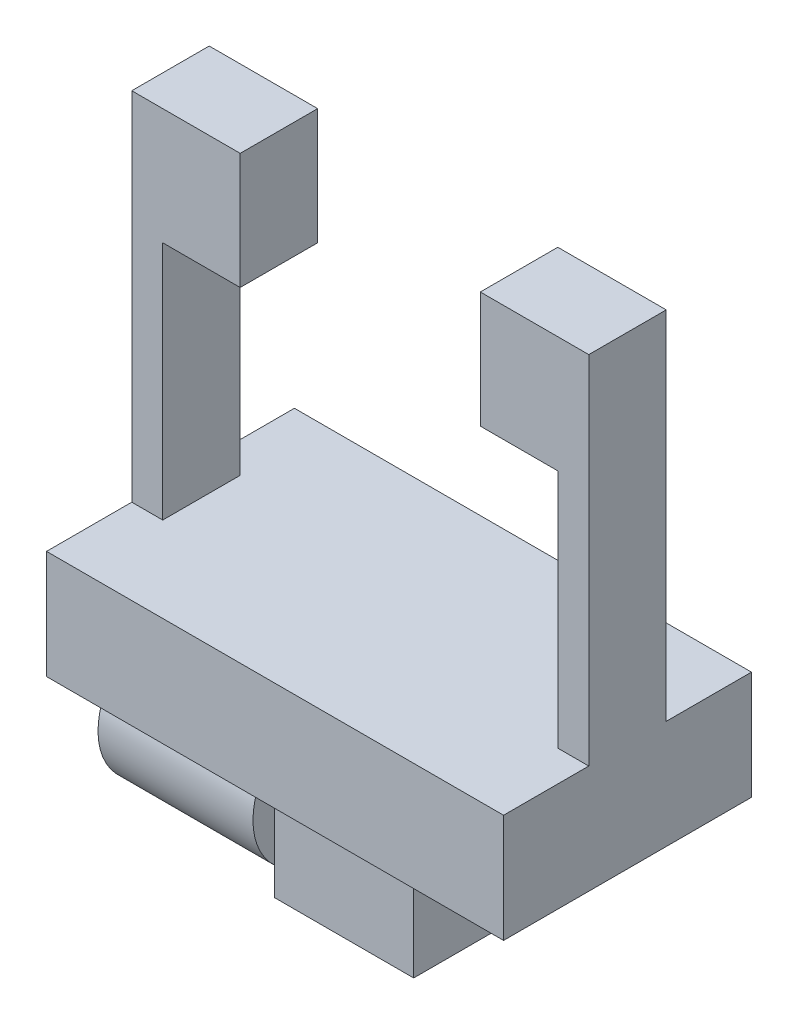
ISO-10303-21;
HEADER;
FILE_DESCRIPTION(('STEP AP214'),'2;1');
FILE_NAME('part.step','',(''),(''),'','','');
FILE_SCHEMA(('AUTOMOTIVE_DESIGN { 1 0 10303 214 1 1 1 1 }'));
ENDSEC;
DATA;
#1=APPLICATION_CONTEXT('core data for automotive mechanical design processes');
#2=APPLICATION_PROTOCOL_DEFINITION('international standard','automotive_design',2000,#1);
#3=PRODUCT_CONTEXT('',#1,'mechanical');
#4=PRODUCT('Part','Part','',(#3));
#5=PRODUCT_RELATED_PRODUCT_CATEGORY('part','',(#4));
#6=PRODUCT_DEFINITION_FORMATION('','',#4);
#7=PRODUCT_DEFINITION_CONTEXT('part definition',#1,'design');
#8=PRODUCT_DEFINITION('design','',#6,#7);
#9=PRODUCT_DEFINITION_SHAPE('','',#8);
#10=(LENGTH_UNIT() NAMED_UNIT(*) SI_UNIT(.MILLI.,.METRE.));
#11=(NAMED_UNIT(*) PLANE_ANGLE_UNIT() SI_UNIT($,.RADIAN.));
#12=(NAMED_UNIT(*) SI_UNIT($,.STERADIAN.) SOLID_ANGLE_UNIT());
#13=UNCERTAINTY_MEASURE_WITH_UNIT(LENGTH_MEASURE(1.E-05),#10,'distance_accuracy_value','');
#14=(GEOMETRIC_REPRESENTATION_CONTEXT(3) GLOBAL_UNCERTAINTY_ASSIGNED_CONTEXT((#13)) GLOBAL_UNIT_ASSIGNED_CONTEXT((#10,
#11,#12)) REPRESENTATION_CONTEXT('',''));
#15=CARTESIAN_POINT('',(0.,0.,0.));
#16=DIRECTION('',(0.,0.,1.));
#17=DIRECTION('',(1.,0.,0.));
#18=AXIS2_PLACEMENT_3D('',#15,#16,#17);
#19=CARTESIAN_POINT('',(-12.8320124123626,-8.89,7.62));
#20=DIRECTION('',(1.,0.,0.));
#21=DIRECTION('',(0.,1.,0.));
#22=AXIS2_PLACEMENT_3D('',#19,#20,#21);
#23=PLANE('',#22);
#24=CARTESIAN_POINT('',(-12.8320124123626,-21.59,0.));
#25=DIRECTION('',(-1.,0.,0.));
#26=DIRECTION('',(0.,-1.,0.));
#27=AXIS2_PLACEMENT_3D('',#24,#25,#26);
#28=CIRCLE('',#27,11.1125);
#29=CARTESIAN_POINT('',(-12.8320124123626,-13.5015356061858,7.62));
#30=VERTEX_POINT('',#29);
#31=CARTESIAN_POINT('',(-12.8320124123626,-13.5015356061858,-7.62));
#32=VERTEX_POINT('',#31);
#33=EDGE_CURVE('E58',#30,#32,#28,.T.);
#34=ORIENTED_EDGE('',*,*,#33,.F.);
#35=DIRECTION('',(0.,-1.,0.));
#36=VECTOR('',#35,1.);
#37=CARTESIAN_POINT('',(-12.8320124123626,-8.89,7.62));
#38=LINE('',#37,#36);
#39=CARTESIAN_POINT('',(-12.8320124123626,-8.89,7.62));
#40=VERTEX_POINT('',#39);
#41=EDGE_CURVE('E199',#40,#30,#38,.T.);
#42=ORIENTED_EDGE('',*,*,#41,.F.);
#43=DIRECTION('',(0.,0.,-1.));
#44=VECTOR('',#43,1.);
#45=CARTESIAN_POINT('',(-12.8320124123626,-8.89,7.62));
#46=LINE('',#45,#44);
#47=CARTESIAN_POINT('',(-12.8320124123626,-8.89,-7.62));
#48=VERTEX_POINT('',#47);
#49=EDGE_CURVE('E239',#40,#48,#46,.T.);
#50=ORIENTED_EDGE('',*,*,#49,.T.);
#51=DIRECTION('',(0.,-1.,0.));
#52=VECTOR('',#51,1.);
#53=CARTESIAN_POINT('',(-12.8320124123626,-8.89,-7.62));
#54=LINE('',#53,#52);
#55=EDGE_CURVE('E238',#48,#32,#54,.T.);
#56=ORIENTED_EDGE('',*,*,#55,.T.);
#57=EDGE_LOOP('',(#34,#42,#50,#56));
#58=FACE_BOUND('',#57,.T.);
#59=ADVANCED_FACE('F42',(#58),#23,.F.);
#60=CARTESIAN_POINT('',(37.465,-8.89,20.32));
#61=DIRECTION('',(-1.,0.,0.));
#62=DIRECTION('',(0.,0.,1.));
#63=AXIS2_PLACEMENT_3D('',#60,#61,#62);
#64=PLANE('',#63);
#65=DIRECTION('',(0.,1.,0.));
#66=VECTOR('',#65,1.);
#67=CARTESIAN_POINT('',(37.465,-8.89,-20.32));
#68=LINE('',#67,#66);
#69=CARTESIAN_POINT('',(37.465,-8.89,-20.32));
#70=VERTEX_POINT('',#69);
#71=CARTESIAN_POINT('',(37.465,8.89,-20.32));
#72=VERTEX_POINT('',#71);
#73=EDGE_CURVE('E357',#70,#72,#68,.T.);
#74=ORIENTED_EDGE('',*,*,#73,.T.);
#75=DIRECTION('',(0.,0.,-1.));
#76=VECTOR('',#75,1.);
#77=CARTESIAN_POINT('',(37.465,8.89,20.32));
#78=LINE('',#77,#76);
#79=CARTESIAN_POINT('',(37.465,8.89,-6.35));
#80=VERTEX_POINT('',#79);
#81=EDGE_CURVE('E52',#80,#72,#78,.T.);
#82=ORIENTED_EDGE('',*,*,#81,.F.);
#83=DIRECTION('',(0.,1.,0.));
#84=VECTOR('',#83,1.);
#85=CARTESIAN_POINT('',(37.465,8.89,-6.35));
#86=LINE('',#85,#84);
#87=CARTESIAN_POINT('',(37.465,67.31,-6.35));
#88=VERTEX_POINT('',#87);
#89=EDGE_CURVE('E346',#80,#88,#86,.T.);
#90=ORIENTED_EDGE('',*,*,#89,.T.);
#91=DIRECTION('',(0.,0.,-1.));
#92=VECTOR('',#91,1.);
#93=CARTESIAN_POINT('',(37.465,67.31,6.35));
#94=LINE('',#93,#92);
#95=CARTESIAN_POINT('',(37.465,67.31,6.35));
#96=VERTEX_POINT('',#95);
#97=EDGE_CURVE('E293',#96,#88,#94,.T.);
#98=ORIENTED_EDGE('',*,*,#97,.F.);
#99=DIRECTION('',(0.,1.,0.));
#100=VECTOR('',#99,1.);
#101=CARTESIAN_POINT('',(37.465,8.89,6.35));
#102=LINE('',#101,#100);
#103=CARTESIAN_POINT('',(37.465,8.89,6.35));
#104=VERTEX_POINT('',#103);
#105=EDGE_CURVE('E372',#104,#96,#102,.T.);
#106=ORIENTED_EDGE('',*,*,#105,.F.);
#107=CARTESIAN_POINT('',(37.465,8.89,20.32));
#108=VERTEX_POINT('',#107);
#109=EDGE_CURVE('E11',#108,#104,#78,.T.);
#110=ORIENTED_EDGE('',*,*,#109,.F.);
#111=DIRECTION('',(0.,1.,0.));
#112=VECTOR('',#111,1.);
#113=CARTESIAN_POINT('',(37.465,-8.89,20.32));
#114=LINE('',#113,#112);
#115=CARTESIAN_POINT('',(37.465,-8.89,20.32));
#116=VERTEX_POINT('',#115);
#117=EDGE_CURVE('E390',#116,#108,#114,.T.);
#118=ORIENTED_EDGE('',*,*,#117,.F.);
#119=DIRECTION('',(0.,0.,-1.));
#120=VECTOR('',#119,1.);
#121=CARTESIAN_POINT('',(37.465,-8.89,20.32));
#122=LINE('',#121,#120);
#123=EDGE_CURVE('E402',#116,#70,#122,.T.);
#124=ORIENTED_EDGE('',*,*,#123,.T.);
#125=EDGE_LOOP('',(#74,#82,#90,#98,#106,#110,#118,#124));
#126=FACE_BOUND('',#125,.T.);
#127=ADVANCED_FACE('F46',(#126),#64,.F.);
#128=CARTESIAN_POINT('',(-37.465,8.89,20.32));
#129=DIRECTION('',(0.,-1.,0.));
#130=DIRECTION('',(0.,0.,-1.));
#131=AXIS2_PLACEMENT_3D('',#128,#129,#130);
#132=PLANE('',#131);
#133=DIRECTION('',(0.,0.,-1.));
#134=VECTOR('',#133,1.);
#135=CARTESIAN_POINT('',(-37.465,8.89,20.32));
#136=LINE('',#135,#134);
#137=CARTESIAN_POINT('',(-37.465,8.89,-6.35));
#138=VERTEX_POINT('',#137);
#139=CARTESIAN_POINT('',(-37.465,8.89,-20.32));
#140=VERTEX_POINT('',#139);
#141=EDGE_CURVE('E419',#138,#140,#136,.T.);
#142=ORIENTED_EDGE('',*,*,#141,.F.);
#143=DIRECTION('',(1.,0.,0.));
#144=VECTOR('',#143,1.);
#145=CARTESIAN_POINT('',(-37.465,8.89,-6.35));
#146=LINE('',#145,#144);
#147=CARTESIAN_POINT('',(-32.385,8.89,-6.35));
#148=VERTEX_POINT('',#147);
#149=EDGE_CURVE('E350',#138,#148,#146,.T.);
#150=ORIENTED_EDGE('',*,*,#149,.T.);
#151=DIRECTION('',(0.,0.,-1.));
#152=VECTOR('',#151,1.);
#153=CARTESIAN_POINT('',(-32.385,8.89,6.35));
#154=LINE('',#153,#152);
#155=CARTESIAN_POINT('',(-32.385,8.89,6.35));
#156=VERTEX_POINT('',#155);
#157=EDGE_CURVE('E359',#156,#148,#154,.T.);
#158=ORIENTED_EDGE('',*,*,#157,.F.);
#159=DIRECTION('',(1.,0.,0.));
#160=VECTOR('',#159,1.);
#161=CARTESIAN_POINT('',(-37.465,8.89,6.35));
#162=LINE('',#161,#160);
#163=CARTESIAN_POINT('',(-37.465,8.89,6.35));
#164=VERTEX_POINT('',#163);
#165=EDGE_CURVE('E331',#164,#156,#162,.T.);
#166=ORIENTED_EDGE('',*,*,#165,.F.);
#167=CARTESIAN_POINT('',(-37.465,8.89,20.32));
#168=VERTEX_POINT('',#167);
#169=EDGE_CURVE('E423',#168,#164,#136,.T.);
#170=ORIENTED_EDGE('',*,*,#169,.F.);
#171=DIRECTION('',(-1.,0.,0.));
#172=VECTOR('',#171,1.);
#173=CARTESIAN_POINT('',(-37.465,8.89,20.32));
#174=LINE('',#173,#172);
#175=EDGE_CURVE('E391',#108,#168,#174,.T.);
#176=ORIENTED_EDGE('',*,*,#175,.F.);
#177=ORIENTED_EDGE('',*,*,#109,.T.);
#178=DIRECTION('',(1.,0.,0.));
#179=VECTOR('',#178,1.);
#180=CARTESIAN_POINT('',(37.465,8.89,6.35));
#181=LINE('',#180,#179);
#182=CARTESIAN_POINT('',(32.385,8.89,6.35));
#183=VERTEX_POINT('',#182);
#184=EDGE_CURVE('E366',#183,#104,#181,.T.);
#185=ORIENTED_EDGE('',*,*,#184,.F.);
#186=DIRECTION('',(0.,0.,-1.));
#187=VECTOR('',#186,1.);
#188=CARTESIAN_POINT('',(32.385,8.89,6.35));
#189=LINE('',#188,#187);
#190=CARTESIAN_POINT('',(32.385,8.89,-6.35));
#191=VERTEX_POINT('',#190);
#192=EDGE_CURVE('E365',#183,#191,#189,.T.);
#193=ORIENTED_EDGE('',*,*,#192,.T.);
#194=DIRECTION('',(1.,0.,0.));
#195=VECTOR('',#194,1.);
#196=CARTESIAN_POINT('',(37.465,8.89,-6.35));
#197=LINE('',#196,#195);
#198=EDGE_CURVE('E369',#191,#80,#197,.T.);
#199=ORIENTED_EDGE('',*,*,#198,.T.);
#200=ORIENTED_EDGE('',*,*,#81,.T.);
#201=DIRECTION('',(-1.,0.,0.));
#202=VECTOR('',#201,1.);
#203=CARTESIAN_POINT('',(-37.465,8.89,-20.32));
#204=LINE('',#203,#202);
#205=EDGE_CURVE('E403',#72,#140,#204,.T.);
#206=ORIENTED_EDGE('',*,*,#205,.T.);
#207=EDGE_LOOP('',(#142,#150,#158,#166,#170,#176,#177,#185,#193,#199,#200,#206));
#208=FACE_BOUND('',#207,.T.);
#209=ADVANCED_FACE('F434',(#208),#132,.F.);
#210=CARTESIAN_POINT('',(-37.465,-8.89,20.32));
#211=DIRECTION('',(1.,0.,0.));
#212=DIRECTION('',(0.,0.,-1.));
#213=AXIS2_PLACEMENT_3D('',#210,#211,#212);
#214=PLANE('',#213);
#215=DIRECTION('',(0.,-1.,0.));
#216=VECTOR('',#215,1.);
#217=CARTESIAN_POINT('',(-37.465,-8.89,-20.32));
#218=LINE('',#217,#216);
#219=CARTESIAN_POINT('',(-37.465,-8.89,-20.32));
#220=VERTEX_POINT('',#219);
#221=EDGE_CURVE('E408',#140,#220,#218,.T.);
#222=ORIENTED_EDGE('',*,*,#221,.T.);
#223=DIRECTION('',(0.,0.,-1.));
#224=VECTOR('',#223,1.);
#225=CARTESIAN_POINT('',(-37.465,-8.89,20.32));
#226=LINE('',#225,#224);
#227=CARTESIAN_POINT('',(-37.465,-8.89,20.32));
#228=VERTEX_POINT('',#227);
#229=EDGE_CURVE('E417',#228,#220,#226,.T.);
#230=ORIENTED_EDGE('',*,*,#229,.F.);
#231=DIRECTION('',(0.,-1.,0.));
#232=VECTOR('',#231,1.);
#233=CARTESIAN_POINT('',(-37.465,-8.89,20.32));
#234=LINE('',#233,#232);
#235=EDGE_CURVE('E394',#168,#228,#234,.T.);
#236=ORIENTED_EDGE('',*,*,#235,.F.);
#237=ORIENTED_EDGE('',*,*,#169,.T.);
#238=DIRECTION('',(0.,-1.,0.));
#239=VECTOR('',#238,1.);
#240=CARTESIAN_POINT('',(-37.465,8.89,6.35));
#241=LINE('',#240,#239);
#242=CARTESIAN_POINT('',(-37.465,67.31,6.35));
#243=VERTEX_POINT('',#242);
#244=EDGE_CURVE('E329',#243,#164,#241,.T.);
#245=ORIENTED_EDGE('',*,*,#244,.F.);
#246=DIRECTION('',(0.,0.,-1.));
#247=VECTOR('',#246,1.);
#248=CARTESIAN_POINT('',(-37.465,67.31,6.35));
#249=LINE('',#248,#247);
#250=CARTESIAN_POINT('',(-37.465,67.31,-6.35));
#251=VERTEX_POINT('',#250);
#252=EDGE_CURVE('E307',#243,#251,#249,.T.);
#253=ORIENTED_EDGE('',*,*,#252,.T.);
#254=DIRECTION('',(0.,-1.,0.));
#255=VECTOR('',#254,1.);
#256=CARTESIAN_POINT('',(-37.465,8.89,-6.35));
#257=LINE('',#256,#255);
#258=EDGE_CURVE('E345',#251,#138,#257,.T.);
#259=ORIENTED_EDGE('',*,*,#258,.T.);
#260=ORIENTED_EDGE('',*,*,#141,.T.);
#261=EDGE_LOOP('',(#222,#230,#236,#237,#245,#253,#259,#260));
#262=FACE_BOUND('',#261,.T.);
#263=ADVANCED_FACE('F427',(#262),#214,.F.);
#264=CARTESIAN_POINT('',(-37.465,-8.89,20.32));
#265=DIRECTION('',(0.,1.,0.));
#266=DIRECTION('',(0.,0.,1.));
#267=AXIS2_PLACEMENT_3D('',#264,#265,#266);
#268=PLANE('',#267);
#269=DIRECTION('',(0.,0.,-1.));
#270=VECTOR('',#269,1.);
#271=CARTESIAN_POINT('',(10.0279875876374,-8.89,7.62));
#272=LINE('',#271,#270);
#273=CARTESIAN_POINT('',(10.0279875876374,-8.89,7.62));
#274=VERTEX_POINT('',#273);
#275=CARTESIAN_POINT('',(10.0279875876374,-8.89,-7.62));
#276=VERTEX_POINT('',#275);
#277=EDGE_CURVE('E258',#274,#276,#272,.T.);
#278=ORIENTED_EDGE('',*,*,#277,.T.);
#279=DIRECTION('',(-1.,0.,0.));
#280=VECTOR('',#279,1.);
#281=CARTESIAN_POINT('',(-12.8320124123626,-8.89,-7.62));
#282=LINE('',#281,#280);
#283=EDGE_CURVE('E213',#276,#48,#282,.T.);
#284=ORIENTED_EDGE('',*,*,#283,.T.);
#285=ORIENTED_EDGE('',*,*,#49,.F.);
#286=DIRECTION('',(-1.,0.,0.));
#287=VECTOR('',#286,1.);
#288=CARTESIAN_POINT('',(-12.8320124123626,-8.89,7.62));
#289=LINE('',#288,#287);
#290=EDGE_CURVE('E237',#274,#40,#289,.T.);
#291=ORIENTED_EDGE('',*,*,#290,.F.);
#292=EDGE_LOOP('',(#278,#284,#285,#291));
#293=FACE_BOUND('',#292,.T.);
#294=DIRECTION('',(1.,0.,0.));
#295=VECTOR('',#294,1.);
#296=CARTESIAN_POINT('',(-37.465,-8.89,-20.32));
#297=LINE('',#296,#295);
#298=EDGE_CURVE('E395',#220,#70,#297,.T.);
#299=ORIENTED_EDGE('',*,*,#298,.T.);
#300=ORIENTED_EDGE('',*,*,#123,.F.);
#301=DIRECTION('',(1.,0.,0.));
#302=VECTOR('',#301,1.);
#303=CARTESIAN_POINT('',(-37.465,-8.89,20.32));
#304=LINE('',#303,#302);
#305=EDGE_CURVE('E400',#228,#116,#304,.T.);
#306=ORIENTED_EDGE('',*,*,#305,.F.);
#307=ORIENTED_EDGE('',*,*,#229,.T.);
#308=EDGE_LOOP('',(#299,#300,#306,#307));
#309=FACE_BOUND('',#308,.T.);
#310=ADVANCED_FACE('F444',(#293,#309),#268,.F.);
#311=CARTESIAN_POINT('',(0.,0.,20.32));
#312=DIRECTION('',(0.,0.,-1.));
#313=DIRECTION('',(-1.,0.,0.));
#314=AXIS2_PLACEMENT_3D('',#311,#312,#313);
#315=PLANE('',#314);
#316=ORIENTED_EDGE('',*,*,#117,.T.);
#317=ORIENTED_EDGE('',*,*,#175,.T.);
#318=ORIENTED_EDGE('',*,*,#235,.T.);
#319=ORIENTED_EDGE('',*,*,#305,.T.);
#320=EDGE_LOOP('',(#316,#317,#318,#319));
#321=FACE_BOUND('',#320,.T.);
#322=ADVANCED_FACE('F449',(#321),#315,.F.);
#323=CARTESIAN_POINT('',(0.,0.,-20.32));
#324=DIRECTION('',(0.,0.,-1.));
#325=DIRECTION('',(-1.,0.,0.));
#326=AXIS2_PLACEMENT_3D('',#323,#324,#325);
#327=PLANE('',#326);
#328=ORIENTED_EDGE('',*,*,#73,.F.);
#329=ORIENTED_EDGE('',*,*,#298,.F.);
#330=ORIENTED_EDGE('',*,*,#221,.F.);
#331=ORIENTED_EDGE('',*,*,#205,.F.);
#332=EDGE_LOOP('',(#328,#329,#330,#331));
#333=FACE_BOUND('',#332,.T.);
#334=ADVANCED_FACE('F439',(#333),#327,.T.);
#335=CARTESIAN_POINT('',(32.385,8.89,6.35));
#336=DIRECTION('',(1.,0.,0.));
#337=DIRECTION('',(0.,0.,-1.));
#338=AXIS2_PLACEMENT_3D('',#335,#336,#337);
#339=PLANE('',#338);
#340=DIRECTION('',(0.,-1.,0.));
#341=VECTOR('',#340,1.);
#342=CARTESIAN_POINT('',(32.385,8.89,-6.35));
#343=LINE('',#342,#341);
#344=CARTESIAN_POINT('',(32.385,48.26,-6.35));
#345=VERTEX_POINT('',#344);
#346=EDGE_CURVE('E373',#345,#191,#343,.T.);
#347=ORIENTED_EDGE('',*,*,#346,.T.);
#348=ORIENTED_EDGE('',*,*,#192,.F.);
#349=DIRECTION('',(0.,-1.,0.));
#350=VECTOR('',#349,1.);
#351=CARTESIAN_POINT('',(32.385,8.89,6.35));
#352=LINE('',#351,#350);
#353=CARTESIAN_POINT('',(32.385,48.26,6.35));
#354=VERTEX_POINT('',#353);
#355=EDGE_CURVE('E385',#354,#183,#352,.T.);
#356=ORIENTED_EDGE('',*,*,#355,.F.);
#357=DIRECTION('',(0.,0.,-1.));
#358=VECTOR('',#357,1.);
#359=CARTESIAN_POINT('',(32.385,48.26,6.35));
#360=LINE('',#359,#358);
#361=EDGE_CURVE('E298',#354,#345,#360,.T.);
#362=ORIENTED_EDGE('',*,*,#361,.T.);
#363=EDGE_LOOP('',(#347,#348,#356,#362));
#364=FACE_BOUND('',#363,.T.);
#365=ADVANCED_FACE('F662',(#364),#339,.F.);
#366=CARTESIAN_POINT('',(0.,0.,6.35));
#367=DIRECTION('',(0.,0.,1.));
#368=DIRECTION('',(1.,0.,0.));
#369=AXIS2_PLACEMENT_3D('',#366,#367,#368);
#370=PLANE('',#369);
#371=ORIENTED_EDGE('',*,*,#105,.T.);
#372=DIRECTION('',(-1.,0.,0.));
#373=VECTOR('',#372,1.);
#374=CARTESIAN_POINT('',(37.465,67.31,6.35));
#375=LINE('',#374,#373);
#376=CARTESIAN_POINT('',(19.685,67.31,6.35));
#377=VERTEX_POINT('',#376);
#378=EDGE_CURVE('E270',#96,#377,#375,.T.);
#379=ORIENTED_EDGE('',*,*,#378,.T.);
#380=DIRECTION('',(0.,-1.,0.));
#381=VECTOR('',#380,1.);
#382=CARTESIAN_POINT('',(19.685,48.26,6.35));
#383=LINE('',#382,#381);
#384=CARTESIAN_POINT('',(19.685,48.26,6.35));
#385=VERTEX_POINT('',#384);
#386=EDGE_CURVE('E269',#377,#385,#383,.T.);
#387=ORIENTED_EDGE('',*,*,#386,.T.);
#388=DIRECTION('',(1.,0.,0.));
#389=VECTOR('',#388,1.);
#390=CARTESIAN_POINT('',(37.465,48.26,6.35));
#391=LINE('',#390,#389);
#392=EDGE_CURVE('E273',#385,#354,#391,.T.);
#393=ORIENTED_EDGE('',*,*,#392,.T.);
#394=ORIENTED_EDGE('',*,*,#355,.T.);
#395=ORIENTED_EDGE('',*,*,#184,.T.);
#396=EDGE_LOOP('',(#371,#379,#387,#393,#394,#395));
#397=FACE_BOUND('',#396,.T.);
#398=ADVANCED_FACE('F663',(#397),#370,.T.);
#399=CARTESIAN_POINT('',(0.,0.,-6.35));
#400=DIRECTION('',(0.,0.,1.));
#401=DIRECTION('',(1.,0.,0.));
#402=AXIS2_PLACEMENT_3D('',#399,#400,#401);
#403=PLANE('',#402);
#404=ORIENTED_EDGE('',*,*,#89,.F.);
#405=ORIENTED_EDGE('',*,*,#198,.F.);
#406=ORIENTED_EDGE('',*,*,#346,.F.);
#407=DIRECTION('',(1.,0.,0.));
#408=VECTOR('',#407,1.);
#409=CARTESIAN_POINT('',(37.465,48.26,-6.35));
#410=LINE('',#409,#408);
#411=CARTESIAN_POINT('',(19.685,48.26,-6.35));
#412=VERTEX_POINT('',#411);
#413=EDGE_CURVE('E271',#412,#345,#410,.T.);
#414=ORIENTED_EDGE('',*,*,#413,.F.);
#415=DIRECTION('',(0.,-1.,0.));
#416=VECTOR('',#415,1.);
#417=CARTESIAN_POINT('',(19.685,48.26,-6.35));
#418=LINE('',#417,#416);
#419=CARTESIAN_POINT('',(19.685,67.31,-6.35));
#420=VERTEX_POINT('',#419);
#421=EDGE_CURVE('E285',#420,#412,#418,.T.);
#422=ORIENTED_EDGE('',*,*,#421,.F.);
#423=DIRECTION('',(-1.,0.,0.));
#424=VECTOR('',#423,1.);
#425=CARTESIAN_POINT('',(37.465,67.31,-6.35));
#426=LINE('',#425,#424);
#427=EDGE_CURVE('E276',#88,#420,#426,.T.);
#428=ORIENTED_EDGE('',*,*,#427,.F.);
#429=EDGE_LOOP('',(#404,#405,#406,#414,#422,#428));
#430=FACE_BOUND('',#429,.T.);
#431=ADVANCED_FACE('F673',(#430),#403,.F.);
#432=CARTESIAN_POINT('',(-32.385,8.89,6.35));
#433=DIRECTION('',(-1.,0.,0.));
#434=DIRECTION('',(0.,0.,1.));
#435=AXIS2_PLACEMENT_3D('',#432,#433,#434);
#436=PLANE('',#435);
#437=DIRECTION('',(0.,1.,0.));
#438=VECTOR('',#437,1.);
#439=CARTESIAN_POINT('',(-32.385,8.89,-6.35));
#440=LINE('',#439,#438);
#441=CARTESIAN_POINT('',(-32.385,48.26,-6.35));
#442=VERTEX_POINT('',#441);
#443=EDGE_CURVE('E333',#148,#442,#440,.T.);
#444=ORIENTED_EDGE('',*,*,#443,.T.);
#445=DIRECTION('',(0.,0.,-1.));
#446=VECTOR('',#445,1.);
#447=CARTESIAN_POINT('',(-32.385,48.26,6.35));
#448=LINE('',#447,#446);
#449=CARTESIAN_POINT('',(-32.385,48.26,6.35));
#450=VERTEX_POINT('',#449);
#451=EDGE_CURVE('E341',#450,#442,#448,.T.);
#452=ORIENTED_EDGE('',*,*,#451,.F.);
#453=DIRECTION('',(0.,1.,0.));
#454=VECTOR('',#453,1.);
#455=CARTESIAN_POINT('',(-32.385,8.89,6.35));
#456=LINE('',#455,#454);
#457=EDGE_CURVE('E338',#156,#450,#456,.T.);
#458=ORIENTED_EDGE('',*,*,#457,.F.);
#459=ORIENTED_EDGE('',*,*,#157,.T.);
#460=EDGE_LOOP('',(#444,#452,#458,#459));
#461=FACE_BOUND('',#460,.T.);
#462=ADVANCED_FACE('F457',(#461),#436,.F.);
#463=CARTESIAN_POINT('',(0.,0.,6.35));
#464=DIRECTION('',(0.,0.,-1.));
#465=DIRECTION('',(-1.,0.,0.));
#466=AXIS2_PLACEMENT_3D('',#463,#464,#465);
#467=PLANE('',#466);
#468=ORIENTED_EDGE('',*,*,#244,.T.);
#469=ORIENTED_EDGE('',*,*,#165,.T.);
#470=ORIENTED_EDGE('',*,*,#457,.T.);
#471=DIRECTION('',(1.,0.,0.));
#472=VECTOR('',#471,1.);
#473=CARTESIAN_POINT('',(-37.465,48.26,6.35));
#474=LINE('',#473,#472);
#475=CARTESIAN_POINT('',(-19.685,48.26,6.35));
#476=VERTEX_POINT('',#475);
#477=EDGE_CURVE('E320',#450,#476,#474,.T.);
#478=ORIENTED_EDGE('',*,*,#477,.T.);
#479=DIRECTION('',(0.,1.,0.));
#480=VECTOR('',#479,1.);
#481=CARTESIAN_POINT('',(-19.685,48.26,6.35));
#482=LINE('',#481,#480);
#483=CARTESIAN_POINT('',(-19.685,67.31,6.35));
#484=VERTEX_POINT('',#483);
#485=EDGE_CURVE('E324',#476,#484,#482,.T.);
#486=ORIENTED_EDGE('',*,*,#485,.T.);
#487=DIRECTION('',(-1.,0.,0.));
#488=VECTOR('',#487,1.);
#489=CARTESIAN_POINT('',(-37.465,67.31,6.35));
#490=LINE('',#489,#488);
#491=EDGE_CURVE('E313',#484,#243,#490,.T.);
#492=ORIENTED_EDGE('',*,*,#491,.T.);
#493=EDGE_LOOP('',(#468,#469,#470,#478,#486,#492));
#494=FACE_BOUND('',#493,.T.);
#495=ADVANCED_FACE('F455',(#494),#467,.F.);
#496=CARTESIAN_POINT('',(0.,0.,-6.35));
#497=DIRECTION('',(0.,0.,-1.));
#498=DIRECTION('',(-1.,0.,0.));
#499=AXIS2_PLACEMENT_3D('',#496,#497,#498);
#500=PLANE('',#499);
#501=ORIENTED_EDGE('',*,*,#258,.F.);
#502=DIRECTION('',(-1.,0.,0.));
#503=VECTOR('',#502,1.);
#504=CARTESIAN_POINT('',(-37.465,67.31,-6.35));
#505=LINE('',#504,#503);
#506=CARTESIAN_POINT('',(-19.685,67.31,-6.35));
#507=VERTEX_POINT('',#506);
#508=EDGE_CURVE('E315',#507,#251,#505,.T.);
#509=ORIENTED_EDGE('',*,*,#508,.F.);
#510=DIRECTION('',(0.,1.,0.));
#511=VECTOR('',#510,1.);
#512=CARTESIAN_POINT('',(-19.685,48.26,-6.35));
#513=LINE('',#512,#511);
#514=CARTESIAN_POINT('',(-19.685,48.26,-6.35));
#515=VERTEX_POINT('',#514);
#516=EDGE_CURVE('E316',#515,#507,#513,.T.);
#517=ORIENTED_EDGE('',*,*,#516,.F.);
#518=DIRECTION('',(1.,0.,0.));
#519=VECTOR('',#518,1.);
#520=CARTESIAN_POINT('',(-37.465,48.26,-6.35));
#521=LINE('',#520,#519);
#522=EDGE_CURVE('E282',#442,#515,#521,.T.);
#523=ORIENTED_EDGE('',*,*,#522,.F.);
#524=ORIENTED_EDGE('',*,*,#443,.F.);
#525=ORIENTED_EDGE('',*,*,#149,.F.);
#526=EDGE_LOOP('',(#501,#509,#517,#523,#524,#525));
#527=FACE_BOUND('',#526,.T.);
#528=ADVANCED_FACE('F475',(#527),#500,.T.);
#529=CARTESIAN_POINT('',(-37.465,48.26,6.35));
#530=DIRECTION('',(0.,1.,0.));
#531=DIRECTION('',(0.,0.,1.));
#532=AXIS2_PLACEMENT_3D('',#529,#530,#531);
#533=PLANE('',#532);
#534=ORIENTED_EDGE('',*,*,#477,.F.);
#535=ORIENTED_EDGE('',*,*,#451,.T.);
#536=ORIENTED_EDGE('',*,*,#522,.T.);
#537=DIRECTION('',(0.,0.,-1.));
#538=VECTOR('',#537,1.);
#539=CARTESIAN_POINT('',(-19.685,48.26,6.35));
#540=LINE('',#539,#538);
#541=EDGE_CURVE('E266',#476,#515,#540,.T.);
#542=ORIENTED_EDGE('',*,*,#541,.F.);
#543=EDGE_LOOP('',(#534,#535,#536,#542));
#544=FACE_BOUND('',#543,.T.);
#545=ADVANCED_FACE('F465',(#544),#533,.F.);
#546=CARTESIAN_POINT('',(-19.685,48.26,6.35));
#547=DIRECTION('',(-1.,0.,0.));
#548=DIRECTION('',(0.,0.,1.));
#549=AXIS2_PLACEMENT_3D('',#546,#547,#548);
#550=PLANE('',#549);
#551=ORIENTED_EDGE('',*,*,#516,.T.);
#552=DIRECTION('',(0.,0.,-1.));
#553=VECTOR('',#552,1.);
#554=CARTESIAN_POINT('',(-19.685,67.31,6.35));
#555=LINE('',#554,#553);
#556=EDGE_CURVE('E305',#484,#507,#555,.T.);
#557=ORIENTED_EDGE('',*,*,#556,.F.);
#558=ORIENTED_EDGE('',*,*,#485,.F.);
#559=ORIENTED_EDGE('',*,*,#541,.T.);
#560=EDGE_LOOP('',(#551,#557,#558,#559));
#561=FACE_BOUND('',#560,.T.);
#562=ADVANCED_FACE('F470',(#561),#550,.F.);
#563=CARTESIAN_POINT('',(-37.465,67.31,6.35));
#564=DIRECTION('',(0.,-1.,0.));
#565=DIRECTION('',(0.,0.,-1.));
#566=AXIS2_PLACEMENT_3D('',#563,#564,#565);
#567=PLANE('',#566);
#568=ORIENTED_EDGE('',*,*,#508,.T.);
#569=ORIENTED_EDGE('',*,*,#252,.F.);
#570=ORIENTED_EDGE('',*,*,#491,.F.);
#571=ORIENTED_EDGE('',*,*,#556,.T.);
#572=EDGE_LOOP('',(#568,#569,#570,#571));
#573=FACE_BOUND('',#572,.T.);
#574=ADVANCED_FACE('F472',(#573),#567,.F.);
#575=CARTESIAN_POINT('',(37.465,67.31,6.35));
#576=DIRECTION('',(0.,-1.,0.));
#577=DIRECTION('',(0.,0.,-1.));
#578=AXIS2_PLACEMENT_3D('',#575,#576,#577);
#579=PLANE('',#578);
#580=ORIENTED_EDGE('',*,*,#427,.T.);
#581=DIRECTION('',(0.,0.,-1.));
#582=VECTOR('',#581,1.);
#583=CARTESIAN_POINT('',(19.685,67.31,6.35));
#584=LINE('',#583,#582);
#585=EDGE_CURVE('E292',#377,#420,#584,.T.);
#586=ORIENTED_EDGE('',*,*,#585,.F.);
#587=ORIENTED_EDGE('',*,*,#378,.F.);
#588=ORIENTED_EDGE('',*,*,#97,.T.);
#589=EDGE_LOOP('',(#580,#586,#587,#588));
#590=FACE_BOUND('',#589,.T.);
#591=ADVANCED_FACE('F510',(#590),#579,.F.);
#592=CARTESIAN_POINT('',(19.685,48.26,6.35));
#593=DIRECTION('',(1.,0.,0.));
#594=DIRECTION('',(0.,0.,-1.));
#595=AXIS2_PLACEMENT_3D('',#592,#593,#594);
#596=PLANE('',#595);
#597=ORIENTED_EDGE('',*,*,#421,.T.);
#598=DIRECTION('',(0.,0.,-1.));
#599=VECTOR('',#598,1.);
#600=CARTESIAN_POINT('',(19.685,48.26,6.35));
#601=LINE('',#600,#599);
#602=EDGE_CURVE('E279',#385,#412,#601,.T.);
#603=ORIENTED_EDGE('',*,*,#602,.F.);
#604=ORIENTED_EDGE('',*,*,#386,.F.);
#605=ORIENTED_EDGE('',*,*,#585,.T.);
#606=EDGE_LOOP('',(#597,#603,#604,#605));
#607=FACE_BOUND('',#606,.T.);
#608=ADVANCED_FACE('F505',(#607),#596,.F.);
#609=CARTESIAN_POINT('',(37.465,48.26,6.35));
#610=DIRECTION('',(0.,1.,0.));
#611=DIRECTION('',(0.,0.,1.));
#612=AXIS2_PLACEMENT_3D('',#609,#610,#611);
#613=PLANE('',#612);
#614=ORIENTED_EDGE('',*,*,#361,.F.);
#615=ORIENTED_EDGE('',*,*,#392,.F.);
#616=ORIENTED_EDGE('',*,*,#602,.T.);
#617=ORIENTED_EDGE('',*,*,#413,.T.);
#618=EDGE_LOOP('',(#614,#615,#616,#617));
#619=FACE_BOUND('',#618,.T.);
#620=ADVANCED_FACE('F493',(#619),#613,.F.);
#621=CARTESIAN_POINT('',(-12.8320124123626,-29.6784643938142,-7.62));
#622=VERTEX_POINT('',#621);
#623=CARTESIAN_POINT('',(-12.8320124123626,-29.6784643938142,7.62));
#624=VERTEX_POINT('',#623);
#625=EDGE_CURVE('E70',#622,#624,#28,.T.);
#626=ORIENTED_EDGE('',*,*,#625,.F.);
#627=CARTESIAN_POINT('',(-12.8320124123626,-34.29,-7.62));
#628=VERTEX_POINT('',#627);
#629=EDGE_CURVE('E202',#622,#628,#54,.T.);
#630=ORIENTED_EDGE('',*,*,#629,.T.);
#631=DIRECTION('',(0.,0.,-1.));
#632=VECTOR('',#631,1.);
#633=CARTESIAN_POINT('',(-12.8320124123626,-34.29,7.62));
#634=LINE('',#633,#632);
#635=CARTESIAN_POINT('',(-12.8320124123626,-34.29,7.62));
#636=VERTEX_POINT('',#635);
#637=EDGE_CURVE('E211',#636,#628,#634,.T.);
#638=ORIENTED_EDGE('',*,*,#637,.F.);
#639=EDGE_CURVE('E196',#624,#636,#38,.T.);
#640=ORIENTED_EDGE('',*,*,#639,.F.);
#641=EDGE_LOOP('',(#626,#630,#638,#640));
#642=FACE_BOUND('',#641,.T.);
#643=ADVANCED_FACE('F207',(#642),#23,.F.);
#644=CARTESIAN_POINT('',(-12.8320124123626,-34.29,7.62));
#645=DIRECTION('',(0.,1.,0.));
#646=DIRECTION('',(0.,0.,1.));
#647=AXIS2_PLACEMENT_3D('',#644,#645,#646);
#648=PLANE('',#647);
#649=DIRECTION('',(1.,0.,0.));
#650=VECTOR('',#649,1.);
#651=CARTESIAN_POINT('',(-12.8320124123626,-34.29,-7.62));
#652=LINE('',#651,#650);
#653=CARTESIAN_POINT('',(10.0279875876374,-34.29,-7.62));
#654=VERTEX_POINT('',#653);
#655=EDGE_CURVE('E242',#628,#654,#652,.T.);
#656=ORIENTED_EDGE('',*,*,#655,.T.);
#657=DIRECTION('',(0.,0.,-1.));
#658=VECTOR('',#657,1.);
#659=CARTESIAN_POINT('',(10.0279875876374,-34.29,7.62));
#660=LINE('',#659,#658);
#661=CARTESIAN_POINT('',(10.0279875876374,-34.29,7.62));
#662=VERTEX_POINT('',#661);
#663=EDGE_CURVE('E257',#662,#654,#660,.T.);
#664=ORIENTED_EDGE('',*,*,#663,.F.);
#665=DIRECTION('',(1.,0.,0.));
#666=VECTOR('',#665,1.);
#667=CARTESIAN_POINT('',(-12.8320124123626,-34.29,7.62));
#668=LINE('',#667,#666);
#669=EDGE_CURVE('E229',#636,#662,#668,.T.);
#670=ORIENTED_EDGE('',*,*,#669,.F.);
#671=ORIENTED_EDGE('',*,*,#637,.T.);
#672=EDGE_LOOP('',(#656,#664,#670,#671));
#673=FACE_BOUND('',#672,.T.);
#674=ADVANCED_FACE('F492',(#673),#648,.F.);
#675=CARTESIAN_POINT('',(10.0279875876374,-8.89,7.62));
#676=DIRECTION('',(-1.,0.,0.));
#677=DIRECTION('',(0.,-1.,0.));
#678=AXIS2_PLACEMENT_3D('',#675,#676,#677);
#679=PLANE('',#678);
#680=DIRECTION('',(0.,1.,0.));
#681=VECTOR('',#680,1.);
#682=CARTESIAN_POINT('',(10.0279875876374,-8.89,-7.62));
#683=LINE('',#682,#681);
#684=EDGE_CURVE('E246',#654,#276,#683,.T.);
#685=ORIENTED_EDGE('',*,*,#684,.T.);
#686=ORIENTED_EDGE('',*,*,#277,.F.);
#687=DIRECTION('',(0.,1.,0.));
#688=VECTOR('',#687,1.);
#689=CARTESIAN_POINT('',(10.0279875876374,-8.89,7.62));
#690=LINE('',#689,#688);
#691=EDGE_CURVE('E235',#662,#274,#690,.T.);
#692=ORIENTED_EDGE('',*,*,#691,.F.);
#693=ORIENTED_EDGE('',*,*,#663,.T.);
#694=EDGE_LOOP('',(#685,#686,#692,#693));
#695=FACE_BOUND('',#694,.T.);
#696=ADVANCED_FACE('F496',(#695),#679,.F.);
#697=CARTESIAN_POINT('',(0.,0.,7.62));
#698=DIRECTION('',(0.,0.,1.));
#699=DIRECTION('',(1.,0.,0.));
#700=AXIS2_PLACEMENT_3D('',#697,#698,#699);
#701=PLANE('',#700);
#702=ORIENTED_EDGE('',*,*,#41,.T.);
#703=EDGE_CURVE('E198',#30,#624,#38,.T.);
#704=ORIENTED_EDGE('',*,*,#703,.T.);
#705=ORIENTED_EDGE('',*,*,#639,.T.);
#706=ORIENTED_EDGE('',*,*,#669,.T.);
#707=ORIENTED_EDGE('',*,*,#691,.T.);
#708=ORIENTED_EDGE('',*,*,#290,.T.);
#709=EDGE_LOOP('',(#702,#704,#705,#706,#707,#708));
#710=FACE_BOUND('',#709,.T.);
#711=ADVANCED_FACE('F197',(#710),#701,.T.);
#712=CARTESIAN_POINT('',(0.,0.,-7.62));
#713=DIRECTION('',(0.,0.,1.));
#714=DIRECTION('',(1.,0.,0.));
#715=AXIS2_PLACEMENT_3D('',#712,#713,#714);
#716=PLANE('',#715);
#717=ORIENTED_EDGE('',*,*,#55,.F.);
#718=ORIENTED_EDGE('',*,*,#283,.F.);
#719=ORIENTED_EDGE('',*,*,#684,.F.);
#720=ORIENTED_EDGE('',*,*,#655,.F.);
#721=ORIENTED_EDGE('',*,*,#629,.F.);
#722=EDGE_CURVE('E243',#32,#622,#54,.T.);
#723=ORIENTED_EDGE('',*,*,#722,.F.);
#724=EDGE_LOOP('',(#717,#718,#719,#720,#721,#723));
#725=FACE_BOUND('',#724,.T.);
#726=ADVANCED_FACE('F565',(#725),#716,.F.);
#727=CARTESIAN_POINT('',(-12.8320124123626,-21.59,0.));
#728=DIRECTION('',(-1.,0.,0.));
#729=DIRECTION('',(0.,-1.,0.));
#730=AXIS2_PLACEMENT_3D('',#727,#728,#729);
#731=PLANE('',#730);
#732=EDGE_CURVE('E218',#32,#622,#28,.T.);
#733=ORIENTED_EDGE('',*,*,#732,.F.);
#734=ORIENTED_EDGE('',*,*,#722,.T.);
#735=EDGE_LOOP('',(#733,#734));
#736=FACE_BOUND('',#735,.T.);
#737=ADVANCED_FACE('F575',(#736),#731,.F.);
#738=CARTESIAN_POINT('',(-38.2320124123626,-21.59,0.));
#739=DIRECTION('',(1.,0.,0.));
#740=DIRECTION('',(0.,1.,0.));
#741=AXIS2_PLACEMENT_3D('',#738,#739,#740);
#742=CYLINDRICAL_SURFACE('',#741,11.1125);
#743=CARTESIAN_POINT('',(-38.2320124123626,-21.59,0.));
#744=DIRECTION('',(-1.,0.,0.));
#745=DIRECTION('',(0.,-1.,0.));
#746=AXIS2_PLACEMENT_3D('',#743,#744,#745);
#747=CIRCLE('',#746,11.1125);
#748=CARTESIAN_POINT('',(-38.2320124123626,-32.7025,0.));
#749=VERTEX_POINT('',#748);
#750=EDGE_CURVE('E206',#749,#749,#747,.T.);
#751=ORIENTED_EDGE('',*,*,#750,.F.);
#752=EDGE_LOOP('',(#751));
#753=FACE_BOUND('',#752,.T.);
#754=EDGE_CURVE('E220',#624,#30,#28,.T.);
#755=ORIENTED_EDGE('',*,*,#754,.T.);
#756=ORIENTED_EDGE('',*,*,#33,.T.);
#757=ORIENTED_EDGE('',*,*,#732,.T.);
#758=ORIENTED_EDGE('',*,*,#625,.T.);
#759=EDGE_LOOP('',(#755,#756,#757,#758));
#760=FACE_BOUND('',#759,.T.);
#761=ADVANCED_FACE('F216',(#753,#760),#742,.T.);
#762=CARTESIAN_POINT('',(-38.2320124123626,-21.59,0.));
#763=DIRECTION('',(-1.,0.,0.));
#764=DIRECTION('',(0.,-1.,0.));
#765=AXIS2_PLACEMENT_3D('',#762,#763,#764);
#766=PLANE('',#765);
#767=ORIENTED_EDGE('',*,*,#750,.T.);
#768=EDGE_LOOP('',(#767));
#769=FACE_BOUND('',#768,.T.);
#770=ADVANCED_FACE('F594',(#769),#766,.T.);
#771=ORIENTED_EDGE('',*,*,#703,.F.);
#772=ORIENTED_EDGE('',*,*,#754,.F.);
#773=EDGE_LOOP('',(#771,#772));
#774=FACE_BOUND('',#773,.T.);
#775=ADVANCED_FACE('F225',(#774),#731,.F.);
#776=CLOSED_SHELL('',(#59,#127,#209,#263,#310,#322,#334,#365,#398,#431,#462,#495,#528,#545,#562,
#574,#591,#608,#620,#643,#674,#696,#711,#726,#737,#761,#770,#775));
#777=MANIFOLD_SOLID_BREP('B2',#776);
#778=ADVANCED_BREP_SHAPE_REPRESENTATION('',(#18,#777),#14);
#779=SHAPE_DEFINITION_REPRESENTATION(#9,#778);
ENDSEC;
END-ISO-10303-21;
